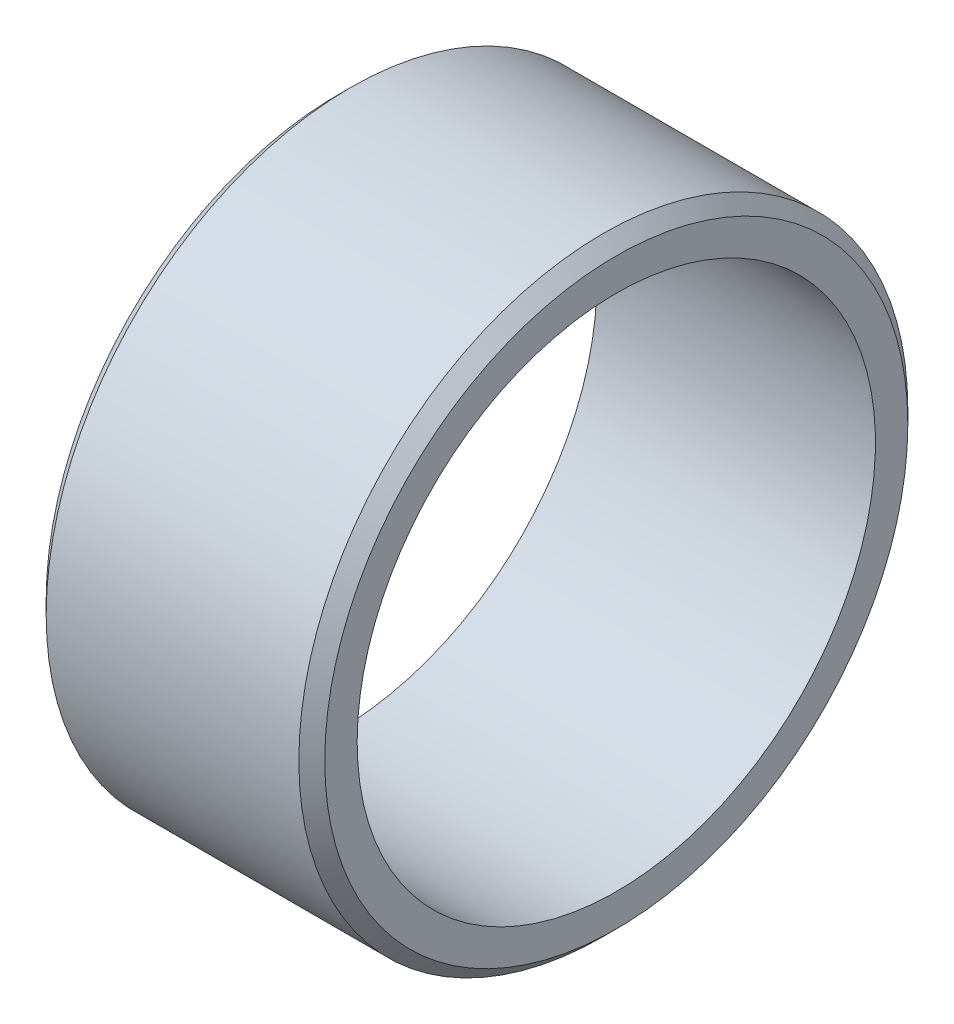
ISO-10303-21;
HEADER;
FILE_DESCRIPTION(('STEP AP214'),'2;1');
FILE_NAME('part.step','',(''),(''),'','','');
FILE_SCHEMA(('AUTOMOTIVE_DESIGN { 1 0 10303 214 1 1 1 1 }'));
ENDSEC;
DATA;
#1=APPLICATION_CONTEXT('core data for automotive mechanical design processes');
#2=APPLICATION_PROTOCOL_DEFINITION('international standard','automotive_design',2000,#1);
#3=PRODUCT_CONTEXT('',#1,'mechanical');
#4=PRODUCT('Part','Part','',(#3));
#5=PRODUCT_RELATED_PRODUCT_CATEGORY('part','',(#4));
#6=PRODUCT_DEFINITION_FORMATION('','',#4);
#7=PRODUCT_DEFINITION_CONTEXT('part definition',#1,'design');
#8=PRODUCT_DEFINITION('design','',#6,#7);
#9=PRODUCT_DEFINITION_SHAPE('','',#8);
#10=(LENGTH_UNIT() NAMED_UNIT(*) SI_UNIT(.MILLI.,.METRE.));
#11=(NAMED_UNIT(*) PLANE_ANGLE_UNIT() SI_UNIT($,.RADIAN.));
#12=(NAMED_UNIT(*) SI_UNIT($,.STERADIAN.) SOLID_ANGLE_UNIT());
#13=UNCERTAINTY_MEASURE_WITH_UNIT(LENGTH_MEASURE(1.E-05),#10,'distance_accuracy_value','');
#14=(GEOMETRIC_REPRESENTATION_CONTEXT(3) GLOBAL_UNCERTAINTY_ASSIGNED_CONTEXT((#13)) GLOBAL_UNIT_ASSIGNED_CONTEXT((#10,
#11,#12)) REPRESENTATION_CONTEXT('',''));
#15=CARTESIAN_POINT('',(0.,0.,0.));
#16=DIRECTION('',(0.,0.,1.));
#17=DIRECTION('',(1.,0.,0.));
#18=AXIS2_PLACEMENT_3D('',#15,#16,#17);
#19=CARTESIAN_POINT('',(0.,22.5,0.));
#20=DIRECTION('',(-1.,0.,0.));
#21=DIRECTION('',(0.,0.,1.));
#22=AXIS2_PLACEMENT_3D('',#19,#20,#21);
#23=PLANE('',#22);
#24=CARTESIAN_POINT('',(0.,0.,0.));
#25=DIRECTION('',(-1.,0.,0.));
#26=DIRECTION('',(0.,0.,1.));
#27=AXIS2_PLACEMENT_3D('',#24,#25,#26);
#28=CIRCLE('',#27,22.5);
#29=CARTESIAN_POINT('',(0.,0.,22.5));
#30=VERTEX_POINT('',#29);
#31=EDGE_CURVE('E10',#30,#30,#28,.T.);
#32=ORIENTED_EDGE('',*,*,#31,.F.);
#33=EDGE_LOOP('',(#32));
#34=FACE_BOUND('',#33,.T.);
#35=CARTESIAN_POINT('',(0.,0.,0.));
#36=DIRECTION('',(-1.,0.,0.));
#37=DIRECTION('',(0.,0.,1.));
#38=AXIS2_PLACEMENT_3D('',#35,#36,#37);
#39=CIRCLE('',#38,20.);
#40=CARTESIAN_POINT('',(0.,0.,20.));
#41=VERTEX_POINT('',#40);
#42=EDGE_CURVE('E54',#41,#41,#39,.T.);
#43=ORIENTED_EDGE('',*,*,#42,.T.);
#44=EDGE_LOOP('',(#43));
#45=FACE_BOUND('',#44,.T.);
#46=ADVANCED_FACE('F32',(#34,#45),#23,.F.);
#47=CARTESIAN_POINT('',(0.,0.,0.));
#48=DIRECTION('',(-1.,0.,0.));
#49=DIRECTION('',(0.,0.,1.));
#50=AXIS2_PLACEMENT_3D('',#47,#48,#49);
#51=CONICAL_SURFACE('',#50,22.5,0.785398163397447);
#52=CARTESIAN_POINT('',(-1.,0.,0.));
#53=DIRECTION('',(-1.,0.,0.));
#54=DIRECTION('',(0.,0.,1.));
#55=AXIS2_PLACEMENT_3D('',#52,#53,#54);
#56=CIRCLE('',#55,23.5);
#57=CARTESIAN_POINT('',(-1.,0.,23.5));
#58=VERTEX_POINT('',#57);
#59=EDGE_CURVE('E38',#58,#58,#56,.T.);
#60=ORIENTED_EDGE('',*,*,#59,.F.);
#61=EDGE_LOOP('',(#60));
#62=FACE_BOUND('',#61,.T.);
#63=ORIENTED_EDGE('',*,*,#31,.T.);
#64=EDGE_LOOP('',(#63));
#65=FACE_BOUND('',#64,.T.);
#66=ADVANCED_FACE('F79',(#62,#65),#51,.T.);
#67=CARTESIAN_POINT('',(-20.663939899833,0.,0.));
#68=DIRECTION('',(-1.,0.,0.));
#69=DIRECTION('',(0.,0.,1.));
#70=AXIS2_PLACEMENT_3D('',#67,#68,#69);
#71=CYLINDRICAL_SURFACE('',#70,23.5);
#72=CARTESIAN_POINT('',(-20.5,0.,0.));
#73=DIRECTION('',(-1.,0.,0.));
#74=DIRECTION('',(0.,0.,1.));
#75=AXIS2_PLACEMENT_3D('',#72,#73,#74);
#76=CIRCLE('',#75,23.5);
#77=CARTESIAN_POINT('',(-20.5,0.,23.5));
#78=VERTEX_POINT('',#77);
#79=EDGE_CURVE('E42',#78,#78,#76,.T.);
#80=ORIENTED_EDGE('',*,*,#79,.F.);
#81=EDGE_LOOP('',(#80));
#82=FACE_BOUND('',#81,.T.);
#83=ORIENTED_EDGE('',*,*,#59,.T.);
#84=EDGE_LOOP('',(#83));
#85=FACE_BOUND('',#84,.T.);
#86=ADVANCED_FACE('F74',(#82,#85),#71,.T.);
#87=CARTESIAN_POINT('',(-20.5,0.,0.));
#88=DIRECTION('',(1.,0.,0.));
#89=DIRECTION('',(0.,0.,-1.));
#90=AXIS2_PLACEMENT_3D('',#87,#88,#89);
#91=CONICAL_SURFACE('',#90,23.5,0.785398163397447);
#92=CARTESIAN_POINT('',(-21.5,0.,0.));
#93=DIRECTION('',(-1.,0.,0.));
#94=DIRECTION('',(0.,0.,1.));
#95=AXIS2_PLACEMENT_3D('',#92,#93,#94);
#96=CIRCLE('',#95,22.5);
#97=CARTESIAN_POINT('',(-21.5,0.,22.5));
#98=VERTEX_POINT('',#97);
#99=EDGE_CURVE('E46',#98,#98,#96,.T.);
#100=ORIENTED_EDGE('',*,*,#99,.F.);
#101=EDGE_LOOP('',(#100));
#102=FACE_BOUND('',#101,.T.);
#103=ORIENTED_EDGE('',*,*,#79,.T.);
#104=EDGE_LOOP('',(#103));
#105=FACE_BOUND('',#104,.T.);
#106=ADVANCED_FACE('F68',(#102,#105),#91,.T.);
#107=CARTESIAN_POINT('',(-21.5,22.5,0.));
#108=DIRECTION('',(1.,0.,0.));
#109=DIRECTION('',(0.,0.,-1.));
#110=AXIS2_PLACEMENT_3D('',#107,#108,#109);
#111=PLANE('',#110);
#112=CARTESIAN_POINT('',(-21.5,0.,0.));
#113=DIRECTION('',(-1.,0.,0.));
#114=DIRECTION('',(0.,0.,1.));
#115=AXIS2_PLACEMENT_3D('',#112,#113,#114);
#116=CIRCLE('',#115,20.);
#117=CARTESIAN_POINT('',(-21.5,0.,20.));
#118=VERTEX_POINT('',#117);
#119=EDGE_CURVE('E51',#118,#118,#116,.T.);
#120=ORIENTED_EDGE('',*,*,#119,.F.);
#121=EDGE_LOOP('',(#120));
#122=FACE_BOUND('',#121,.T.);
#123=ORIENTED_EDGE('',*,*,#99,.T.);
#124=EDGE_LOOP('',(#123));
#125=FACE_BOUND('',#124,.T.);
#126=ADVANCED_FACE('F62',(#122,#125),#111,.F.);
#127=CARTESIAN_POINT('',(-20.663939899833,0.,0.));
#128=DIRECTION('',(-1.,0.,0.));
#129=DIRECTION('',(0.,0.,1.));
#130=AXIS2_PLACEMENT_3D('',#127,#128,#129);
#131=CYLINDRICAL_SURFACE('',#130,20.);
#132=ORIENTED_EDGE('',*,*,#42,.F.);
#133=EDGE_LOOP('',(#132));
#134=FACE_BOUND('',#133,.T.);
#135=ORIENTED_EDGE('',*,*,#119,.T.);
#136=EDGE_LOOP('',(#135));
#137=FACE_BOUND('',#136,.T.);
#138=ADVANCED_FACE('F59',(#134,#137),#131,.F.);
#139=CLOSED_SHELL('',(#46,#66,#86,#106,#126,#138));
#140=MANIFOLD_SOLID_BREP('B2',#139);
#141=ADVANCED_BREP_SHAPE_REPRESENTATION('',(#18,#140),#14);
#142=SHAPE_DEFINITION_REPRESENTATION(#9,#141);
ENDSEC;
END-ISO-10303-21;
